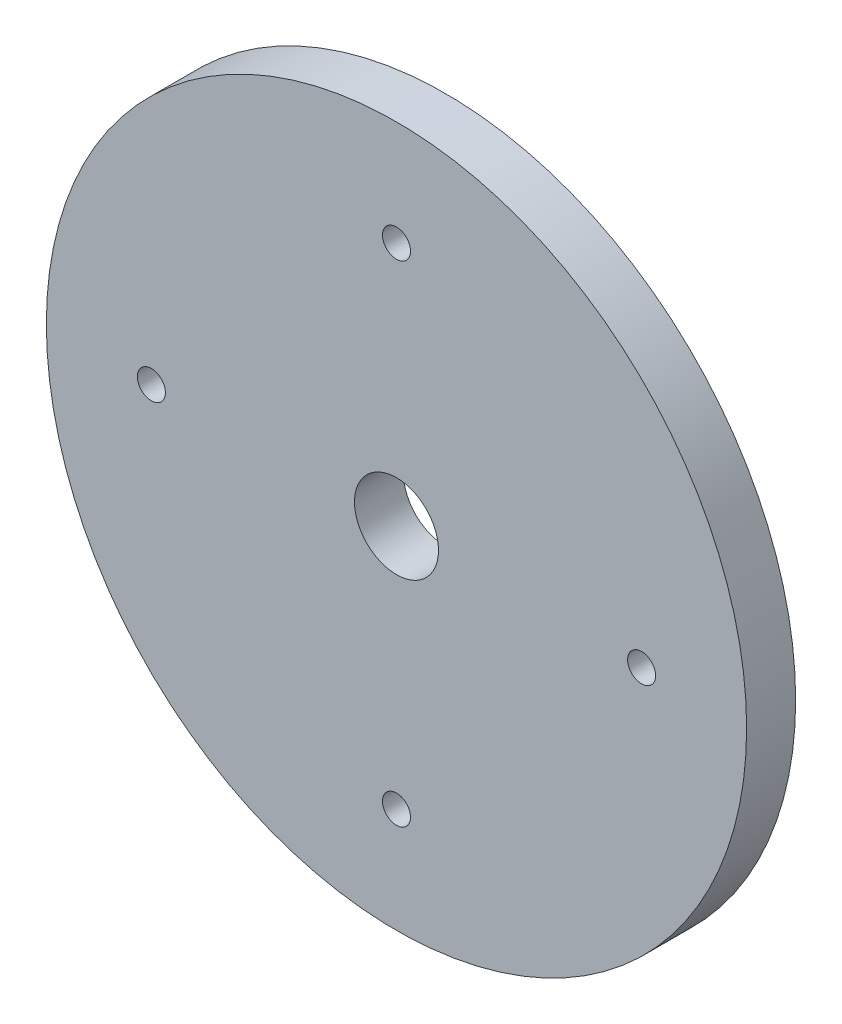
ISO-10303-21;
HEADER;
FILE_DESCRIPTION(('STEP AP214'),'2;1');
FILE_NAME('part.step','',(''),(''),'','','');
FILE_SCHEMA(('AUTOMOTIVE_DESIGN { 1 0 10303 214 1 1 1 1 }'));
ENDSEC;
DATA;
#1=APPLICATION_CONTEXT('core data for automotive mechanical design processes');
#2=APPLICATION_PROTOCOL_DEFINITION('international standard','automotive_design',2000,#1);
#3=PRODUCT_CONTEXT('',#1,'mechanical');
#4=PRODUCT('Part','Part','',(#3));
#5=PRODUCT_RELATED_PRODUCT_CATEGORY('part','',(#4));
#6=PRODUCT_DEFINITION_FORMATION('','',#4);
#7=PRODUCT_DEFINITION_CONTEXT('part definition',#1,'design');
#8=PRODUCT_DEFINITION('design','',#6,#7);
#9=PRODUCT_DEFINITION_SHAPE('','',#8);
#10=(LENGTH_UNIT() NAMED_UNIT(*) SI_UNIT(.MILLI.,.METRE.));
#11=(NAMED_UNIT(*) PLANE_ANGLE_UNIT() SI_UNIT($,.RADIAN.));
#12=(NAMED_UNIT(*) SI_UNIT($,.STERADIAN.) SOLID_ANGLE_UNIT());
#13=UNCERTAINTY_MEASURE_WITH_UNIT(LENGTH_MEASURE(1.E-05),#10,'distance_accuracy_value','');
#14=(GEOMETRIC_REPRESENTATION_CONTEXT(3) GLOBAL_UNCERTAINTY_ASSIGNED_CONTEXT((#13)) GLOBAL_UNIT_ASSIGNED_CONTEXT((#10,
#11,#12)) REPRESENTATION_CONTEXT('',''));
#15=CARTESIAN_POINT('',(0.,0.,0.));
#16=DIRECTION('',(0.,0.,1.));
#17=DIRECTION('',(1.,0.,0.));
#18=AXIS2_PLACEMENT_3D('',#15,#16,#17);
#19=CARTESIAN_POINT('',(0.,0.,7.));
#20=DIRECTION('',(0.,0.,1.));
#21=DIRECTION('',(1.,0.,0.));
#22=AXIS2_PLACEMENT_3D('',#19,#20,#21);
#23=PLANE('',#22);
#24=CARTESIAN_POINT('',(0.,35.,7.));
#25=DIRECTION('',(0.,0.,1.));
#26=DIRECTION('',(1.,0.,0.));
#27=AXIS2_PLACEMENT_3D('',#24,#25,#26);
#28=CIRCLE('',#27,2.);
#29=CARTESIAN_POINT('',(2.,35.,7.));
#30=VERTEX_POINT('',#29);
#31=EDGE_CURVE('E72',#30,#30,#28,.T.);
#32=ORIENTED_EDGE('',*,*,#31,.F.);
#33=EDGE_LOOP('',(#32));
#34=FACE_BOUND('',#33,.T.);
#35=CARTESIAN_POINT('',(0.,-35.,7.));
#36=DIRECTION('',(0.,0.,1.));
#37=DIRECTION('',(1.,0.,0.));
#38=AXIS2_PLACEMENT_3D('',#35,#36,#37);
#39=CIRCLE('',#38,2.);
#40=CARTESIAN_POINT('',(2.,-35.,7.));
#41=VERTEX_POINT('',#40);
#42=EDGE_CURVE('E66',#41,#41,#39,.T.);
#43=ORIENTED_EDGE('',*,*,#42,.F.);
#44=EDGE_LOOP('',(#43));
#45=FACE_BOUND('',#44,.T.);
#46=CARTESIAN_POINT('',(-35.,0.,7.));
#47=DIRECTION('',(0.,0.,1.));
#48=DIRECTION('',(1.,0.,0.));
#49=AXIS2_PLACEMENT_3D('',#46,#47,#48);
#50=CIRCLE('',#49,2.);
#51=CARTESIAN_POINT('',(-33.,0.,7.));
#52=VERTEX_POINT('',#51);
#53=EDGE_CURVE('E60',#52,#52,#50,.T.);
#54=ORIENTED_EDGE('',*,*,#53,.F.);
#55=EDGE_LOOP('',(#54));
#56=FACE_BOUND('',#55,.T.);
#57=CARTESIAN_POINT('',(35.,0.,7.));
#58=DIRECTION('',(0.,0.,1.));
#59=DIRECTION('',(1.,0.,0.));
#60=AXIS2_PLACEMENT_3D('',#57,#58,#59);
#61=CIRCLE('',#60,2.);
#62=CARTESIAN_POINT('',(37.,0.,7.));
#63=VERTEX_POINT('',#62);
#64=EDGE_CURVE('E54',#63,#63,#61,.T.);
#65=ORIENTED_EDGE('',*,*,#64,.F.);
#66=EDGE_LOOP('',(#65));
#67=FACE_BOUND('',#66,.T.);
#68=CARTESIAN_POINT('',(0.,0.,7.));
#69=DIRECTION('',(0.,0.,1.));
#70=DIRECTION('',(1.,0.,0.));
#71=AXIS2_PLACEMENT_3D('',#68,#69,#70);
#72=CIRCLE('',#71,50.);
#73=CARTESIAN_POINT('',(50.,0.,7.));
#74=VERTEX_POINT('',#73);
#75=EDGE_CURVE('E10',#74,#74,#72,.T.);
#76=ORIENTED_EDGE('',*,*,#75,.T.);
#77=EDGE_LOOP('',(#76));
#78=FACE_BOUND('',#77,.T.);
#79=CARTESIAN_POINT('',(0.,0.,7.));
#80=DIRECTION('',(0.,0.,1.));
#81=DIRECTION('',(1.,0.,0.));
#82=AXIS2_PLACEMENT_3D('',#79,#80,#81);
#83=CIRCLE('',#82,6.);
#84=CARTESIAN_POINT('',(6.,0.,7.));
#85=VERTEX_POINT('',#84);
#86=EDGE_CURVE('E46',#85,#85,#83,.T.);
#87=ORIENTED_EDGE('',*,*,#86,.F.);
#88=EDGE_LOOP('',(#87));
#89=FACE_BOUND('',#88,.T.);
#90=ADVANCED_FACE('F35',(#34,#45,#56,#67,#78,#89),#23,.T.);
#91=CARTESIAN_POINT('',(0.,0.,0.));
#92=DIRECTION('',(0.,0.,1.));
#93=DIRECTION('',(1.,0.,0.));
#94=AXIS2_PLACEMENT_3D('',#91,#92,#93);
#95=PLANE('',#94);
#96=CARTESIAN_POINT('',(0.,35.,0.));
#97=DIRECTION('',(0.,0.,1.));
#98=DIRECTION('',(1.,0.,0.));
#99=AXIS2_PLACEMENT_3D('',#96,#97,#98);
#100=CIRCLE('',#99,2.);
#101=CARTESIAN_POINT('',(2.,35.,0.));
#102=VERTEX_POINT('',#101);
#103=EDGE_CURVE('E51',#102,#102,#100,.T.);
#104=ORIENTED_EDGE('',*,*,#103,.T.);
#105=EDGE_LOOP('',(#104));
#106=FACE_BOUND('',#105,.T.);
#107=CARTESIAN_POINT('',(0.,-35.,0.));
#108=DIRECTION('',(0.,0.,1.));
#109=DIRECTION('',(1.,0.,0.));
#110=AXIS2_PLACEMENT_3D('',#107,#108,#109);
#111=CIRCLE('',#110,2.);
#112=CARTESIAN_POINT('',(2.,-35.,0.));
#113=VERTEX_POINT('',#112);
#114=EDGE_CURVE('E69',#113,#113,#111,.T.);
#115=ORIENTED_EDGE('',*,*,#114,.T.);
#116=EDGE_LOOP('',(#115));
#117=FACE_BOUND('',#116,.T.);
#118=CARTESIAN_POINT('',(-35.,0.,0.));
#119=DIRECTION('',(0.,0.,1.));
#120=DIRECTION('',(1.,0.,0.));
#121=AXIS2_PLACEMENT_3D('',#118,#119,#120);
#122=CIRCLE('',#121,2.);
#123=CARTESIAN_POINT('',(-33.,0.,0.));
#124=VERTEX_POINT('',#123);
#125=EDGE_CURVE('E63',#124,#124,#122,.T.);
#126=ORIENTED_EDGE('',*,*,#125,.T.);
#127=EDGE_LOOP('',(#126));
#128=FACE_BOUND('',#127,.T.);
#129=CARTESIAN_POINT('',(35.,0.,0.));
#130=DIRECTION('',(0.,0.,1.));
#131=DIRECTION('',(1.,0.,0.));
#132=AXIS2_PLACEMENT_3D('',#129,#130,#131);
#133=CIRCLE('',#132,2.);
#134=CARTESIAN_POINT('',(37.,0.,0.));
#135=VERTEX_POINT('',#134);
#136=EDGE_CURVE('E57',#135,#135,#133,.T.);
#137=ORIENTED_EDGE('',*,*,#136,.T.);
#138=EDGE_LOOP('',(#137));
#139=FACE_BOUND('',#138,.T.);
#140=CARTESIAN_POINT('',(0.,0.,0.));
#141=DIRECTION('',(0.,0.,1.));
#142=DIRECTION('',(1.,0.,0.));
#143=AXIS2_PLACEMENT_3D('',#140,#141,#142);
#144=CIRCLE('',#143,50.);
#145=CARTESIAN_POINT('',(50.,0.,0.));
#146=VERTEX_POINT('',#145);
#147=EDGE_CURVE('E39',#146,#146,#144,.T.);
#148=ORIENTED_EDGE('',*,*,#147,.F.);
#149=EDGE_LOOP('',(#148));
#150=FACE_BOUND('',#149,.T.);
#151=CARTESIAN_POINT('',(0.,0.,0.));
#152=DIRECTION('',(0.,0.,1.));
#153=DIRECTION('',(1.,0.,0.));
#154=AXIS2_PLACEMENT_3D('',#151,#152,#153);
#155=CIRCLE('',#154,6.);
#156=CARTESIAN_POINT('',(6.,0.,0.));
#157=VERTEX_POINT('',#156);
#158=EDGE_CURVE('E48',#157,#157,#155,.T.);
#159=ORIENTED_EDGE('',*,*,#158,.T.);
#160=EDGE_LOOP('',(#159));
#161=FACE_BOUND('',#160,.T.);
#162=ADVANCED_FACE('F78',(#106,#117,#128,#139,#150,#161),#95,.F.);
#163=CARTESIAN_POINT('',(0.,0.,7.));
#164=DIRECTION('',(0.,0.,-1.));
#165=DIRECTION('',(-1.,0.,0.));
#166=AXIS2_PLACEMENT_3D('',#163,#164,#165);
#167=CYLINDRICAL_SURFACE('',#166,50.);
#168=ORIENTED_EDGE('',*,*,#75,.F.);
#169=EDGE_LOOP('',(#168));
#170=FACE_BOUND('',#169,.T.);
#171=ORIENTED_EDGE('',*,*,#147,.T.);
#172=EDGE_LOOP('',(#171));
#173=FACE_BOUND('',#172,.T.);
#174=ADVANCED_FACE('F37',(#170,#173),#167,.T.);
#175=CARTESIAN_POINT('',(0.,0.,7.));
#176=DIRECTION('',(0.,0.,-1.));
#177=DIRECTION('',(-1.,0.,0.));
#178=AXIS2_PLACEMENT_3D('',#175,#176,#177);
#179=CYLINDRICAL_SURFACE('',#178,6.);
#180=ORIENTED_EDGE('',*,*,#86,.T.);
#181=EDGE_LOOP('',(#180));
#182=FACE_BOUND('',#181,.T.);
#183=ORIENTED_EDGE('',*,*,#158,.F.);
#184=EDGE_LOOP('',(#183));
#185=FACE_BOUND('',#184,.T.);
#186=ADVANCED_FACE('F99',(#182,#185),#179,.F.);
#187=CARTESIAN_POINT('',(35.,0.,0.));
#188=DIRECTION('',(0.,0.,1.));
#189=DIRECTION('',(1.,0.,0.));
#190=AXIS2_PLACEMENT_3D('',#187,#188,#189);
#191=CYLINDRICAL_SURFACE('',#190,2.);
#192=ORIENTED_EDGE('',*,*,#136,.F.);
#193=EDGE_LOOP('',(#192));
#194=FACE_BOUND('',#193,.T.);
#195=ORIENTED_EDGE('',*,*,#64,.T.);
#196=EDGE_LOOP('',(#195));
#197=FACE_BOUND('',#196,.T.);
#198=ADVANCED_FACE('F102',(#194,#197),#191,.F.);
#199=CARTESIAN_POINT('',(-35.,0.,0.));
#200=DIRECTION('',(0.,0.,1.));
#201=DIRECTION('',(1.,0.,0.));
#202=AXIS2_PLACEMENT_3D('',#199,#200,#201);
#203=CYLINDRICAL_SURFACE('',#202,2.);
#204=ORIENTED_EDGE('',*,*,#125,.F.);
#205=EDGE_LOOP('',(#204));
#206=FACE_BOUND('',#205,.T.);
#207=ORIENTED_EDGE('',*,*,#53,.T.);
#208=EDGE_LOOP('',(#207));
#209=FACE_BOUND('',#208,.T.);
#210=ADVANCED_FACE('F114',(#206,#209),#203,.F.);
#211=CARTESIAN_POINT('',(0.,-35.,0.));
#212=DIRECTION('',(0.,0.,1.));
#213=DIRECTION('',(1.,0.,0.));
#214=AXIS2_PLACEMENT_3D('',#211,#212,#213);
#215=CYLINDRICAL_SURFACE('',#214,2.);
#216=ORIENTED_EDGE('',*,*,#114,.F.);
#217=EDGE_LOOP('',(#216));
#218=FACE_BOUND('',#217,.T.);
#219=ORIENTED_EDGE('',*,*,#42,.T.);
#220=EDGE_LOOP('',(#219));
#221=FACE_BOUND('',#220,.T.);
#222=ADVANCED_FACE('F84',(#218,#221),#215,.F.);
#223=CARTESIAN_POINT('',(0.,35.,0.));
#224=DIRECTION('',(0.,0.,1.));
#225=DIRECTION('',(1.,0.,0.));
#226=AXIS2_PLACEMENT_3D('',#223,#224,#225);
#227=CYLINDRICAL_SURFACE('',#226,2.);
#228=ORIENTED_EDGE('',*,*,#103,.F.);
#229=EDGE_LOOP('',(#228));
#230=FACE_BOUND('',#229,.T.);
#231=ORIENTED_EDGE('',*,*,#31,.T.);
#232=EDGE_LOOP('',(#231));
#233=FACE_BOUND('',#232,.T.);
#234=ADVANCED_FACE('F81',(#230,#233),#227,.F.);
#235=CLOSED_SHELL('',(#90,#162,#174,#186,#198,#210,#222,#234));
#236=MANIFOLD_SOLID_BREP('B2',#235);
#237=ADVANCED_BREP_SHAPE_REPRESENTATION('',(#18,#236),#14);
#238=SHAPE_DEFINITION_REPRESENTATION(#9,#237);
ENDSEC;
END-ISO-10303-21;
